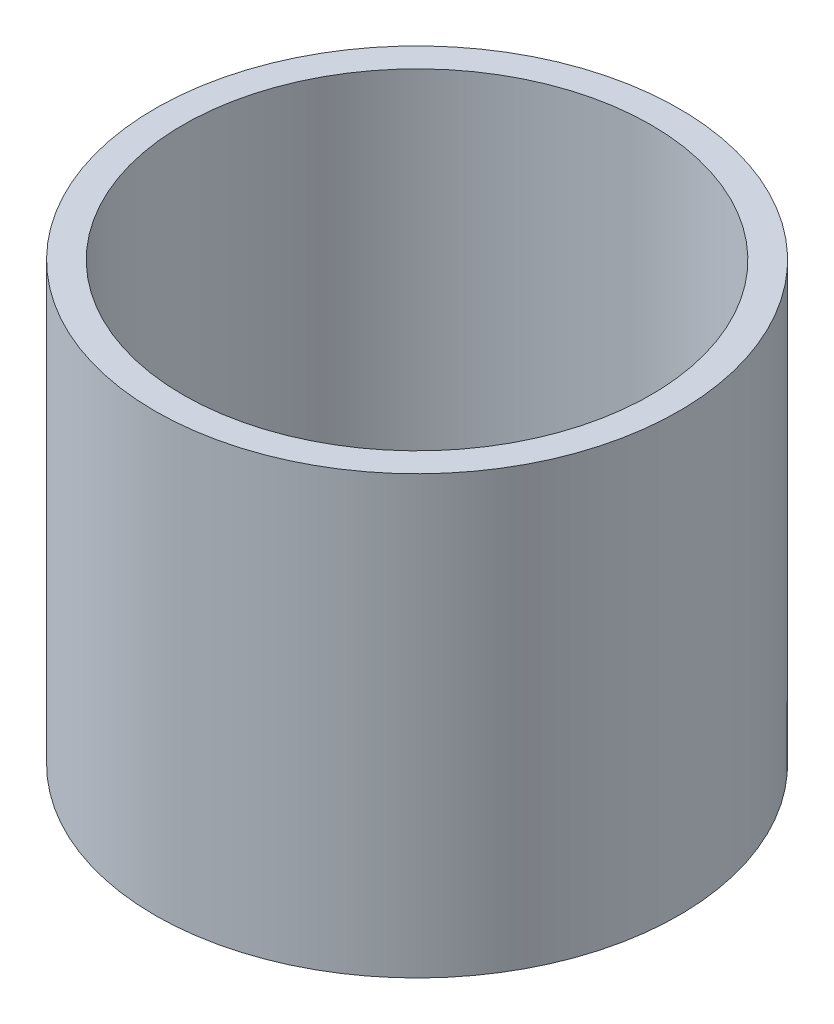
ISO-10303-21;
HEADER;
FILE_DESCRIPTION(('STEP AP214'),'2;1');
FILE_NAME('part.step','',(''),(''),'','','');
FILE_SCHEMA(('AUTOMOTIVE_DESIGN { 1 0 10303 214 1 1 1 1 }'));
ENDSEC;
DATA;
#1=APPLICATION_CONTEXT('core data for automotive mechanical design processes');
#2=APPLICATION_PROTOCOL_DEFINITION('international standard','automotive_design',2000,#1);
#3=PRODUCT_CONTEXT('',#1,'mechanical');
#4=PRODUCT('Part','Part','',(#3));
#5=PRODUCT_RELATED_PRODUCT_CATEGORY('part','',(#4));
#6=PRODUCT_DEFINITION_FORMATION('','',#4);
#7=PRODUCT_DEFINITION_CONTEXT('part definition',#1,'design');
#8=PRODUCT_DEFINITION('design','',#6,#7);
#9=PRODUCT_DEFINITION_SHAPE('','',#8);
#10=(LENGTH_UNIT() NAMED_UNIT(*) SI_UNIT(.MILLI.,.METRE.));
#11=(NAMED_UNIT(*) PLANE_ANGLE_UNIT() SI_UNIT($,.RADIAN.));
#12=(NAMED_UNIT(*) SI_UNIT($,.STERADIAN.) SOLID_ANGLE_UNIT());
#13=UNCERTAINTY_MEASURE_WITH_UNIT(LENGTH_MEASURE(1.E-05),#10,'distance_accuracy_value','');
#14=(GEOMETRIC_REPRESENTATION_CONTEXT(3) GLOBAL_UNCERTAINTY_ASSIGNED_CONTEXT((#13)) GLOBAL_UNIT_ASSIGNED_CONTEXT((#10,
#11,#12)) REPRESENTATION_CONTEXT('',''));
#15=CARTESIAN_POINT('',(0.,0.,0.));
#16=DIRECTION('',(0.,0.,1.));
#17=DIRECTION('',(1.,0.,0.));
#18=AXIS2_PLACEMENT_3D('',#15,#16,#17);
#19=CARTESIAN_POINT('',(0.,140.,0.));
#20=DIRECTION('',(0.,1.,0.));
#21=DIRECTION('',(0.,0.,1.));
#22=AXIS2_PLACEMENT_3D('',#19,#20,#21);
#23=PLANE('',#22);
#24=CARTESIAN_POINT('',(0.,140.,0.));
#25=DIRECTION('',(0.,1.,0.));
#26=DIRECTION('',(0.,0.,1.));
#27=AXIS2_PLACEMENT_3D('',#24,#25,#26);
#28=CIRCLE('',#27,84.);
#29=CARTESIAN_POINT('',(0.,140.,84.));
#30=VERTEX_POINT('',#29);
#31=EDGE_CURVE('E10',#30,#30,#28,.T.);
#32=ORIENTED_EDGE('',*,*,#31,.T.);
#33=EDGE_LOOP('',(#32));
#34=FACE_BOUND('',#33,.T.);
#35=CARTESIAN_POINT('',(0.,140.,0.));
#36=DIRECTION('',(0.,1.,0.));
#37=DIRECTION('',(0.,0.,1.));
#38=AXIS2_PLACEMENT_3D('',#35,#36,#37);
#39=CIRCLE('',#38,75.);
#40=CARTESIAN_POINT('',(0.,140.,75.));
#41=VERTEX_POINT('',#40);
#42=EDGE_CURVE('E50',#41,#41,#39,.T.);
#43=ORIENTED_EDGE('',*,*,#42,.F.);
#44=EDGE_LOOP('',(#43));
#45=FACE_BOUND('',#44,.T.);
#46=ADVANCED_FACE('F37',(#34,#45),#23,.T.);
#47=CARTESIAN_POINT('',(0.,0.,0.));
#48=DIRECTION('',(0.,1.,0.));
#49=DIRECTION('',(0.,0.,1.));
#50=AXIS2_PLACEMENT_3D('',#47,#48,#49);
#51=PLANE('',#50);
#52=CARTESIAN_POINT('',(0.,0.,0.));
#53=DIRECTION('',(0.,1.,0.));
#54=DIRECTION('',(0.,0.,1.));
#55=AXIS2_PLACEMENT_3D('',#52,#53,#54);
#56=CIRCLE('',#55,84.);
#57=CARTESIAN_POINT('',(0.,0.,84.));
#58=VERTEX_POINT('',#57);
#59=EDGE_CURVE('E41',#58,#58,#56,.T.);
#60=ORIENTED_EDGE('',*,*,#59,.F.);
#61=EDGE_LOOP('',(#60));
#62=FACE_BOUND('',#61,.T.);
#63=CARTESIAN_POINT('',(0.,0.,0.));
#64=DIRECTION('',(0.,1.,0.));
#65=DIRECTION('',(0.,0.,1.));
#66=AXIS2_PLACEMENT_3D('',#63,#64,#65);
#67=CIRCLE('',#66,75.);
#68=CARTESIAN_POINT('',(0.,0.,75.));
#69=VERTEX_POINT('',#68);
#70=EDGE_CURVE('E52',#69,#69,#67,.T.);
#71=ORIENTED_EDGE('',*,*,#70,.T.);
#72=EDGE_LOOP('',(#71));
#73=FACE_BOUND('',#72,.T.);
#74=ADVANCED_FACE('F64',(#62,#73),#51,.F.);
#75=CARTESIAN_POINT('',(0.,140.,0.));
#76=DIRECTION('',(0.,-1.,0.));
#77=DIRECTION('',(0.,0.,-1.));
#78=AXIS2_PLACEMENT_3D('',#75,#76,#77);
#79=CYLINDRICAL_SURFACE('',#78,84.);
#80=ORIENTED_EDGE('',*,*,#31,.F.);
#81=EDGE_LOOP('',(#80));
#82=FACE_BOUND('',#81,.T.);
#83=ORIENTED_EDGE('',*,*,#59,.T.);
#84=EDGE_LOOP('',(#83));
#85=FACE_BOUND('',#84,.T.);
#86=ADVANCED_FACE('F39',(#82,#85),#79,.T.);
#87=CARTESIAN_POINT('',(0.,140.,0.));
#88=DIRECTION('',(0.,-1.,0.));
#89=DIRECTION('',(0.,0.,-1.));
#90=AXIS2_PLACEMENT_3D('',#87,#88,#89);
#91=CYLINDRICAL_SURFACE('',#90,75.);
#92=ORIENTED_EDGE('',*,*,#42,.T.);
#93=EDGE_LOOP('',(#92));
#94=FACE_BOUND('',#93,.T.);
#95=ORIENTED_EDGE('',*,*,#70,.F.);
#96=EDGE_LOOP('',(#95));
#97=FACE_BOUND('',#96,.T.);
#98=ADVANCED_FACE('F60',(#94,#97),#91,.F.);
#99=CLOSED_SHELL('',(#46,#74,#86,#98));
#100=MANIFOLD_SOLID_BREP('B2',#99);
#101=ADVANCED_BREP_SHAPE_REPRESENTATION('',(#18,#100),#14);
#102=SHAPE_DEFINITION_REPRESENTATION(#9,#101);
ENDSEC;
END-ISO-10303-21;
